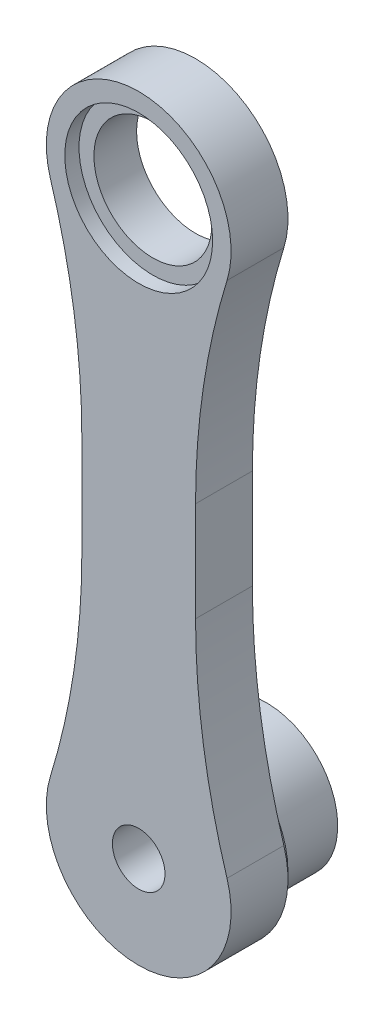
ISO-10303-21;
HEADER;
FILE_DESCRIPTION(('STEP AP214'),'2;1');
FILE_NAME('part.step','',(''),(''),'','','');
FILE_SCHEMA(('AUTOMOTIVE_DESIGN { 1 0 10303 214 1 1 1 1 }'));
ENDSEC;
DATA;
#1=APPLICATION_CONTEXT('core data for automotive mechanical design processes');
#2=APPLICATION_PROTOCOL_DEFINITION('international standard','automotive_design',2000,#1);
#3=PRODUCT_CONTEXT('',#1,'mechanical');
#4=PRODUCT('Part','Part','',(#3));
#5=PRODUCT_RELATED_PRODUCT_CATEGORY('part','',(#4));
#6=PRODUCT_DEFINITION_FORMATION('','',#4);
#7=PRODUCT_DEFINITION_CONTEXT('part definition',#1,'design');
#8=PRODUCT_DEFINITION('design','',#6,#7);
#9=PRODUCT_DEFINITION_SHAPE('','',#8);
#10=(LENGTH_UNIT() NAMED_UNIT(*) SI_UNIT(.MILLI.,.METRE.));
#11=(NAMED_UNIT(*) PLANE_ANGLE_UNIT() SI_UNIT($,.RADIAN.));
#12=(NAMED_UNIT(*) SI_UNIT($,.STERADIAN.) SOLID_ANGLE_UNIT());
#13=UNCERTAINTY_MEASURE_WITH_UNIT(LENGTH_MEASURE(1.E-05),#10,'distance_accuracy_value','');
#14=(GEOMETRIC_REPRESENTATION_CONTEXT(3) GLOBAL_UNCERTAINTY_ASSIGNED_CONTEXT((#13)) GLOBAL_UNIT_ASSIGNED_CONTEXT((#10,
#11,#12)) REPRESENTATION_CONTEXT('',''));
#15=CARTESIAN_POINT('',(0.,0.,0.));
#16=DIRECTION('',(0.,0.,1.));
#17=DIRECTION('',(1.,0.,0.));
#18=AXIS2_PLACEMENT_3D('',#15,#16,#17);
#19=CARTESIAN_POINT('',(-1.99995814207109,-6.32850083022723,4.));
#20=DIRECTION('',(0.,0.,-1.));
#21=DIRECTION('',(-1.,0.,0.));
#22=AXIS2_PLACEMENT_3D('',#19,#20,#21);
#23=CYLINDRICAL_SURFACE('',#22,4.15);
#24=CARTESIAN_POINT('',(-1.99995814207109,-6.32850083022723,0.));
#25=DIRECTION('',(0.,0.,1.));
#26=DIRECTION('',(-1.,0.,0.));
#27=AXIS2_PLACEMENT_3D('',#24,#25,#26);
#28=CIRCLE('',#27,4.15);
#29=CARTESIAN_POINT('',(-6.14995814207109,-6.32850083022723,0.));
#30=VERTEX_POINT('',#29);
#31=EDGE_CURVE('E128',#30,#30,#28,.T.);
#32=ORIENTED_EDGE('',*,*,#31,.F.);
#33=EDGE_LOOP('',(#32));
#34=FACE_BOUND('',#33,.T.);
#35=CARTESIAN_POINT('',(-1.99995814207109,-6.32850083022723,3.));
#36=DIRECTION('',(0.,0.,1.));
#37=DIRECTION('',(1.,0.,0.));
#38=AXIS2_PLACEMENT_3D('',#35,#36,#37);
#39=CIRCLE('',#38,4.15);
#40=CARTESIAN_POINT('',(2.15004185792891,-6.32850083022723,3.));
#41=VERTEX_POINT('',#40);
#42=EDGE_CURVE('E37',#41,#41,#39,.T.);
#43=ORIENTED_EDGE('',*,*,#42,.T.);
#44=EDGE_LOOP('',(#43));
#45=FACE_BOUND('',#44,.T.);
#46=ADVANCED_FACE('F33',(#34,#45),#23,.F.);
#47=CARTESIAN_POINT('',(-1.99995814207109,-46.5754515961868,4.));
#48=DIRECTION('',(0.,0.,-1.));
#49=DIRECTION('',(-1.,0.,0.));
#50=AXIS2_PLACEMENT_3D('',#47,#48,#49);
#51=PLANE('',#50);
#52=CARTESIAN_POINT('',(-1.99995814207109,-6.32850083022723,4.));
#53=DIRECTION('',(0.,0.,1.));
#54=DIRECTION('',(1.,0.,0.));
#55=AXIS2_PLACEMENT_3D('',#52,#53,#54);
#56=CIRCLE('',#55,5.2);
#57=CARTESIAN_POINT('',(3.20004185792891,-6.32850083022723,4.));
#58=VERTEX_POINT('',#57);
#59=EDGE_CURVE('E185',#58,#58,#56,.T.);
#60=ORIENTED_EDGE('',*,*,#59,.F.);
#61=EDGE_LOOP('',(#60));
#62=FACE_BOUND('',#61,.T.);
#63=CARTESIAN_POINT('',(-1.99995814207109,-46.5754515961868,4.));
#64=DIRECTION('',(0.,0.,-1.));
#65=DIRECTION('',(-1.,0.,0.));
#66=AXIS2_PLACEMENT_3D('',#63,#64,#65);
#67=CIRCLE('',#66,1.85);
#68=CARTESIAN_POINT('',(-3.84995814207109,-46.5754515961868,4.));
#69=VERTEX_POINT('',#68);
#70=EDGE_CURVE('E168',#69,#69,#67,.T.);
#71=ORIENTED_EDGE('',*,*,#70,.T.);
#72=EDGE_LOOP('',(#71));
#73=FACE_BOUND('',#72,.T.);
#74=DIRECTION('',(0.,-1.,0.));
#75=VECTOR('',#74,1.);
#76=CARTESIAN_POINT('',(-5.99995814207109,-11.451976213207,4.));
#77=LINE('',#76,#75);
#78=CARTESIAN_POINT('',(-5.99995814207109,-22.9492709688219,4.));
#79=VERTEX_POINT('',#78);
#80=CARTESIAN_POINT('',(-5.99995814207109,-29.9546814575922,4.));
#81=VERTEX_POINT('',#80);
#82=EDGE_CURVE('E137',#79,#81,#77,.T.);
#83=ORIENTED_EDGE('',*,*,#82,.T.);
#84=CARTESIAN_POINT('',(-55.9999581420711,-29.9546814575922,4.));
#85=DIRECTION('',(0.,0.,-1.));
#86=DIRECTION('',(-1.,0.,0.));
#87=AXIS2_PLACEMENT_3D('',#84,#85,#86);
#88=CIRCLE('',#87,50.);
#89=CARTESIAN_POINT('',(-8.21234752260206,-44.6633275979414,4.));
#90=VERTEX_POINT('',#89);
#91=EDGE_CURVE('E110',#81,#90,#88,.T.);
#92=ORIENTED_EDGE('',*,*,#91,.T.);
#93=CARTESIAN_POINT('',(-1.99995814207109,-46.5754515961868,4.));
#94=DIRECTION('',(0.,0.,1.));
#95=DIRECTION('',(-1.,0.,0.));
#96=AXIS2_PLACEMENT_3D('',#93,#94,#95);
#97=CIRCLE('',#96,6.5);
#98=CARTESIAN_POINT('',(4.21243123845988,-44.6633275979414,4.));
#99=VERTEX_POINT('',#98);
#100=EDGE_CURVE('E119',#90,#99,#97,.T.);
#101=ORIENTED_EDGE('',*,*,#100,.T.);
#102=CARTESIAN_POINT('',(52.0000418579289,-29.9546814575921,4.));
#103=DIRECTION('',(0.,0.,-1.));
#104=DIRECTION('',(-1.,0.,0.));
#105=AXIS2_PLACEMENT_3D('',#102,#103,#104);
#106=CIRCLE('',#105,50.);
#107=CARTESIAN_POINT('',(2.00004185792891,-29.9546814575921,4.));
#108=VERTEX_POINT('',#107);
#109=EDGE_CURVE('E158',#99,#108,#106,.T.);
#110=ORIENTED_EDGE('',*,*,#109,.T.);
#111=DIRECTION('',(0.,1.,0.));
#112=VECTOR('',#111,1.);
#113=CARTESIAN_POINT('',(2.00004185792891,-11.451976213207,4.));
#114=LINE('',#113,#112);
#115=CARTESIAN_POINT('',(2.00004185792891,-22.9492709688219,4.));
#116=VERTEX_POINT('',#115);
#117=EDGE_CURVE('E197',#108,#116,#114,.T.);
#118=ORIENTED_EDGE('',*,*,#117,.T.);
#119=CARTESIAN_POINT('',(52.0000418579289,-22.9492709688219,4.));
#120=DIRECTION('',(0.,0.,-1.));
#121=DIRECTION('',(-1.,0.,0.));
#122=AXIS2_PLACEMENT_3D('',#119,#120,#121);
#123=CIRCLE('',#122,50.);
#124=CARTESIAN_POINT('',(4.21243123845988,-8.24062482847263,4.));
#125=VERTEX_POINT('',#124);
#126=EDGE_CURVE('E11',#116,#125,#123,.T.);
#127=ORIENTED_EDGE('',*,*,#126,.T.);
#128=CARTESIAN_POINT('',(-1.99995814207109,-6.32850083022723,4.));
#129=DIRECTION('',(0.,0.,1.));
#130=DIRECTION('',(1.,0.,0.));
#131=AXIS2_PLACEMENT_3D('',#128,#129,#130);
#132=CIRCLE('',#131,6.5);
#133=CARTESIAN_POINT('',(-8.21234752260206,-8.24062482847263,4.));
#134=VERTEX_POINT('',#133);
#135=EDGE_CURVE('E198',#125,#134,#132,.T.);
#136=ORIENTED_EDGE('',*,*,#135,.T.);
#137=CARTESIAN_POINT('',(-55.9999581420711,-22.9492709688219,4.));
#138=DIRECTION('',(0.,0.,-1.));
#139=DIRECTION('',(-1.,0.,0.));
#140=AXIS2_PLACEMENT_3D('',#137,#138,#139);
#141=CIRCLE('',#140,50.);
#142=EDGE_CURVE('E162',#134,#79,#141,.T.);
#143=ORIENTED_EDGE('',*,*,#142,.T.);
#144=EDGE_LOOP('',(#83,#92,#101,#110,#118,#127,#136,#143));
#145=FACE_BOUND('',#144,.T.);
#146=ADVANCED_FACE('F202',(#62,#73,#145),#51,.F.);
#147=CARTESIAN_POINT('',(-1.99995814207109,-46.5754515961868,0.));
#148=DIRECTION('',(0.,0.,-1.));
#149=DIRECTION('',(-1.,0.,0.));
#150=AXIS2_PLACEMENT_3D('',#147,#148,#149);
#151=PLANE('',#150);
#152=CARTESIAN_POINT('',(-1.99995814207109,-46.5754515961868,0.));
#153=DIRECTION('',(0.,0.,-1.));
#154=DIRECTION('',(-1.,0.,0.));
#155=AXIS2_PLACEMENT_3D('',#152,#153,#154);
#156=CIRCLE('',#155,6.);
#157=CARTESIAN_POINT('',(-7.99995814207109,-46.5754515961868,0.));
#158=VERTEX_POINT('',#157);
#159=EDGE_CURVE('E188',#158,#158,#156,.T.);
#160=ORIENTED_EDGE('',*,*,#159,.F.);
#161=EDGE_LOOP('',(#160));
#162=FACE_BOUND('',#161,.T.);
#163=CARTESIAN_POINT('',(-1.99995814207109,-46.5754515961868,0.));
#164=DIRECTION('',(0.,0.,1.));
#165=DIRECTION('',(-1.,0.,0.));
#166=AXIS2_PLACEMENT_3D('',#163,#164,#165);
#167=CIRCLE('',#166,6.5);
#168=CARTESIAN_POINT('',(-8.21234752260206,-44.6633275979414,0.));
#169=VERTEX_POINT('',#168);
#170=CARTESIAN_POINT('',(4.21243123845988,-44.6633275979414,0.));
#171=VERTEX_POINT('',#170);
#172=EDGE_CURVE('E116',#169,#171,#167,.T.);
#173=ORIENTED_EDGE('',*,*,#172,.F.);
#174=CARTESIAN_POINT('',(-55.9999581420711,-29.9546814575922,0.));
#175=DIRECTION('',(0.,0.,-1.));
#176=DIRECTION('',(-1.,0.,0.));
#177=AXIS2_PLACEMENT_3D('',#174,#175,#176);
#178=CIRCLE('',#177,50.);
#179=CARTESIAN_POINT('',(-5.99995814207109,-29.9546814575922,0.));
#180=VERTEX_POINT('',#179);
#181=EDGE_CURVE('E100',#169,#180,#178,.F.);
#182=ORIENTED_EDGE('',*,*,#181,.T.);
#183=DIRECTION('',(0.,-1.,0.));
#184=VECTOR('',#183,1.);
#185=CARTESIAN_POINT('',(-5.99995814207109,-11.451976213207,0.));
#186=LINE('',#185,#184);
#187=CARTESIAN_POINT('',(-5.99995814207109,-22.9492709688219,0.));
#188=VERTEX_POINT('',#187);
#189=EDGE_CURVE('E141',#188,#180,#186,.T.);
#190=ORIENTED_EDGE('',*,*,#189,.F.);
#191=CARTESIAN_POINT('',(-55.9999581420711,-22.9492709688219,0.));
#192=DIRECTION('',(0.,0.,-1.));
#193=DIRECTION('',(-1.,0.,0.));
#194=AXIS2_PLACEMENT_3D('',#191,#192,#193);
#195=CIRCLE('',#194,50.);
#196=CARTESIAN_POINT('',(-8.21234752260206,-8.24062482847263,0.));
#197=VERTEX_POINT('',#196);
#198=EDGE_CURVE('E160',#188,#197,#195,.F.);
#199=ORIENTED_EDGE('',*,*,#198,.T.);
#200=CARTESIAN_POINT('',(-1.99995814207109,-6.32850083022723,0.));
#201=DIRECTION('',(0.,0.,1.));
#202=DIRECTION('',(1.,0.,0.));
#203=AXIS2_PLACEMENT_3D('',#200,#201,#202);
#204=CIRCLE('',#203,6.5);
#205=CARTESIAN_POINT('',(4.21243123845988,-8.24062482847263,0.));
#206=VERTEX_POINT('',#205);
#207=EDGE_CURVE('E131',#206,#197,#204,.T.);
#208=ORIENTED_EDGE('',*,*,#207,.F.);
#209=CARTESIAN_POINT('',(52.0000418579289,-22.9492709688219,0.));
#210=DIRECTION('',(0.,0.,-1.));
#211=DIRECTION('',(-1.,0.,0.));
#212=AXIS2_PLACEMENT_3D('',#209,#210,#211);
#213=CIRCLE('',#212,50.);
#214=CARTESIAN_POINT('',(2.00004185792891,-22.9492709688219,0.));
#215=VERTEX_POINT('',#214);
#216=EDGE_CURVE('E42',#206,#215,#213,.F.);
#217=ORIENTED_EDGE('',*,*,#216,.T.);
#218=DIRECTION('',(0.,1.,0.));
#219=VECTOR('',#218,1.);
#220=CARTESIAN_POINT('',(2.00004185792891,-11.451976213207,0.));
#221=LINE('',#220,#219);
#222=CARTESIAN_POINT('',(2.00004185792891,-29.9546814575921,0.));
#223=VERTEX_POINT('',#222);
#224=EDGE_CURVE('E127',#223,#215,#221,.T.);
#225=ORIENTED_EDGE('',*,*,#224,.F.);
#226=CARTESIAN_POINT('',(52.0000418579289,-29.9546814575921,0.));
#227=DIRECTION('',(0.,0.,-1.));
#228=DIRECTION('',(-1.,0.,0.));
#229=AXIS2_PLACEMENT_3D('',#226,#227,#228);
#230=CIRCLE('',#229,50.);
#231=EDGE_CURVE('E126',#223,#171,#230,.F.);
#232=ORIENTED_EDGE('',*,*,#231,.T.);
#233=EDGE_LOOP('',(#173,#182,#190,#199,#208,#217,#225,#232));
#234=FACE_BOUND('',#233,.T.);
#235=ORIENTED_EDGE('',*,*,#31,.T.);
#236=EDGE_LOOP('',(#235));
#237=FACE_BOUND('',#236,.T.);
#238=ADVANCED_FACE('F123',(#162,#234,#237),#151,.T.);
#239=CARTESIAN_POINT('',(-1.99995814207109,-46.5754515961868,4.));
#240=DIRECTION('',(0.,0.,-1.));
#241=DIRECTION('',(-1.,0.,0.));
#242=AXIS2_PLACEMENT_3D('',#239,#240,#241);
#243=CYLINDRICAL_SURFACE('',#242,6.5);
#244=ORIENTED_EDGE('',*,*,#100,.F.);
#245=DIRECTION('',(0.,0.,-1.));
#246=VECTOR('',#245,1.);
#247=CARTESIAN_POINT('',(-8.21234752260206,-44.6633275979414,4.));
#248=LINE('',#247,#246);
#249=EDGE_CURVE('E104',#90,#169,#248,.T.);
#250=ORIENTED_EDGE('',*,*,#249,.T.);
#251=ORIENTED_EDGE('',*,*,#172,.T.);
#252=DIRECTION('',(0.,0.,-1.));
#253=VECTOR('',#252,1.);
#254=CARTESIAN_POINT('',(4.21243123845988,-44.6633275979414,4.));
#255=LINE('',#254,#253);
#256=EDGE_CURVE('E121',#171,#99,#255,.F.);
#257=ORIENTED_EDGE('',*,*,#256,.T.);
#258=EDGE_LOOP('',(#244,#250,#251,#257));
#259=FACE_BOUND('',#258,.T.);
#260=ADVANCED_FACE('F115',(#259),#243,.T.);
#261=CARTESIAN_POINT('',(2.00004185792891,-11.451976213207,4.));
#262=DIRECTION('',(-1.,0.,0.));
#263=DIRECTION('',(0.,-1.,0.));
#264=AXIS2_PLACEMENT_3D('',#261,#262,#263);
#265=PLANE('',#264);
#266=ORIENTED_EDGE('',*,*,#117,.F.);
#267=DIRECTION('',(0.,0.,1.));
#268=VECTOR('',#267,1.);
#269=CARTESIAN_POINT('',(2.00004185792891,-29.9546814575921,0.));
#270=LINE('',#269,#268);
#271=EDGE_CURVE('E149',#108,#223,#270,.F.);
#272=ORIENTED_EDGE('',*,*,#271,.T.);
#273=ORIENTED_EDGE('',*,*,#224,.T.);
#274=DIRECTION('',(0.,0.,1.));
#275=VECTOR('',#274,1.);
#276=CARTESIAN_POINT('',(2.00004185792891,-22.9492709688219,4.));
#277=LINE('',#276,#275);
#278=EDGE_CURVE('E147',#215,#116,#277,.T.);
#279=ORIENTED_EDGE('',*,*,#278,.T.);
#280=EDGE_LOOP('',(#266,#272,#273,#279));
#281=FACE_BOUND('',#280,.T.);
#282=ADVANCED_FACE('F215',(#281),#265,.F.);
#283=CARTESIAN_POINT('',(-1.99995814207109,-6.32850083022723,4.));
#284=DIRECTION('',(0.,0.,-1.));
#285=DIRECTION('',(-1.,0.,0.));
#286=AXIS2_PLACEMENT_3D('',#283,#284,#285);
#287=CYLINDRICAL_SURFACE('',#286,6.5);
#288=ORIENTED_EDGE('',*,*,#207,.T.);
#289=DIRECTION('',(0.,0.,-1.));
#290=VECTOR('',#289,1.);
#291=CARTESIAN_POINT('',(-8.21234752260206,-8.24062482847263,4.));
#292=LINE('',#291,#290);
#293=EDGE_CURVE('E50',#197,#134,#292,.F.);
#294=ORIENTED_EDGE('',*,*,#293,.T.);
#295=ORIENTED_EDGE('',*,*,#135,.F.);
#296=DIRECTION('',(0.,0.,-1.));
#297=VECTOR('',#296,1.);
#298=CARTESIAN_POINT('',(4.21243123845988,-8.24062482847263,4.));
#299=LINE('',#298,#297);
#300=EDGE_CURVE('E152',#125,#206,#299,.T.);
#301=ORIENTED_EDGE('',*,*,#300,.T.);
#302=EDGE_LOOP('',(#288,#294,#295,#301));
#303=FACE_BOUND('',#302,.T.);
#304=ADVANCED_FACE('F209',(#303),#287,.T.);
#305=CARTESIAN_POINT('',(-5.99995814207109,-11.451976213207,4.));
#306=DIRECTION('',(1.,0.,0.));
#307=DIRECTION('',(0.,0.,-1.));
#308=AXIS2_PLACEMENT_3D('',#305,#306,#307);
#309=PLANE('',#308);
#310=ORIENTED_EDGE('',*,*,#189,.T.);
#311=DIRECTION('',(0.,0.,1.));
#312=VECTOR('',#311,1.);
#313=CARTESIAN_POINT('',(-5.99995814207109,-29.9546814575922,4.));
#314=LINE('',#313,#312);
#315=EDGE_CURVE('E105',#180,#81,#314,.T.);
#316=ORIENTED_EDGE('',*,*,#315,.T.);
#317=ORIENTED_EDGE('',*,*,#82,.F.);
#318=DIRECTION('',(0.,0.,1.));
#319=VECTOR('',#318,1.);
#320=CARTESIAN_POINT('',(-5.99995814207109,-22.9492709688219,0.));
#321=LINE('',#320,#319);
#322=EDGE_CURVE('E120',#79,#188,#321,.F.);
#323=ORIENTED_EDGE('',*,*,#322,.T.);
#324=EDGE_LOOP('',(#310,#316,#317,#323));
#325=FACE_BOUND('',#324,.T.);
#326=ADVANCED_FACE('F205',(#325),#309,.F.);
#327=CARTESIAN_POINT('',(-55.9999581420711,-29.9546814575922,4.));
#328=DIRECTION('',(0.,0.,-1.));
#329=DIRECTION('',(-1.,0.,0.));
#330=AXIS2_PLACEMENT_3D('',#327,#328,#329);
#331=CYLINDRICAL_SURFACE('',#330,50.);
#332=ORIENTED_EDGE('',*,*,#91,.F.);
#333=ORIENTED_EDGE('',*,*,#315,.F.);
#334=ORIENTED_EDGE('',*,*,#181,.F.);
#335=ORIENTED_EDGE('',*,*,#249,.F.);
#336=EDGE_LOOP('',(#332,#333,#334,#335));
#337=FACE_BOUND('',#336,.T.);
#338=ADVANCED_FACE('F103',(#337),#331,.F.);
#339=CARTESIAN_POINT('',(52.0000418579289,-29.9546814575921,4.));
#340=DIRECTION('',(0.,0.,-1.));
#341=DIRECTION('',(-1.,0.,0.));
#342=AXIS2_PLACEMENT_3D('',#339,#340,#341);
#343=CYLINDRICAL_SURFACE('',#342,50.);
#344=ORIENTED_EDGE('',*,*,#109,.F.);
#345=ORIENTED_EDGE('',*,*,#256,.F.);
#346=ORIENTED_EDGE('',*,*,#231,.F.);
#347=ORIENTED_EDGE('',*,*,#271,.F.);
#348=EDGE_LOOP('',(#344,#345,#346,#347));
#349=FACE_BOUND('',#348,.T.);
#350=ADVANCED_FACE('F219',(#349),#343,.F.);
#351=CARTESIAN_POINT('',(-55.9999581420711,-22.9492709688219,4.));
#352=DIRECTION('',(0.,0.,-1.));
#353=DIRECTION('',(-1.,0.,0.));
#354=AXIS2_PLACEMENT_3D('',#351,#352,#353);
#355=CYLINDRICAL_SURFACE('',#354,50.);
#356=ORIENTED_EDGE('',*,*,#142,.F.);
#357=ORIENTED_EDGE('',*,*,#293,.F.);
#358=ORIENTED_EDGE('',*,*,#198,.F.);
#359=ORIENTED_EDGE('',*,*,#322,.F.);
#360=EDGE_LOOP('',(#356,#357,#358,#359));
#361=FACE_BOUND('',#360,.T.);
#362=ADVANCED_FACE('F207',(#361),#355,.F.);
#363=CARTESIAN_POINT('',(52.0000418579289,-22.9492709688219,4.));
#364=DIRECTION('',(0.,0.,-1.));
#365=DIRECTION('',(-1.,0.,0.));
#366=AXIS2_PLACEMENT_3D('',#363,#364,#365);
#367=CYLINDRICAL_SURFACE('',#366,50.);
#368=ORIENTED_EDGE('',*,*,#126,.F.);
#369=ORIENTED_EDGE('',*,*,#278,.F.);
#370=ORIENTED_EDGE('',*,*,#216,.F.);
#371=ORIENTED_EDGE('',*,*,#300,.F.);
#372=EDGE_LOOP('',(#368,#369,#370,#371));
#373=FACE_BOUND('',#372,.T.);
#374=ADVANCED_FACE('F35',(#373),#367,.F.);
#375=CARTESIAN_POINT('',(-1.99995814207109,-46.5754515961868,-0.5));
#376=DIRECTION('',(0.,0.,1.));
#377=DIRECTION('',(1.,0.,0.));
#378=AXIS2_PLACEMENT_3D('',#375,#376,#377);
#379=CYLINDRICAL_SURFACE('',#378,6.);
#380=CARTESIAN_POINT('',(-1.99995814207109,-46.5754515961868,-0.5));
#381=DIRECTION('',(0.,0.,-1.));
#382=DIRECTION('',(-1.,0.,0.));
#383=AXIS2_PLACEMENT_3D('',#380,#381,#382);
#384=CIRCLE('',#383,6.);
#385=CARTESIAN_POINT('',(-7.99995814207109,-46.5754515961868,-0.5));
#386=VERTEX_POINT('',#385);
#387=EDGE_CURVE('E167',#386,#386,#384,.T.);
#388=ORIENTED_EDGE('',*,*,#387,.F.);
#389=EDGE_LOOP('',(#388));
#390=FACE_BOUND('',#389,.T.);
#391=ORIENTED_EDGE('',*,*,#159,.T.);
#392=EDGE_LOOP('',(#391));
#393=FACE_BOUND('',#392,.T.);
#394=ADVANCED_FACE('F289',(#390,#393),#379,.T.);
#395=CARTESIAN_POINT('',(-1.99995814207109,-46.5754515961868,-0.5));
#396=DIRECTION('',(0.,0.,-1.));
#397=DIRECTION('',(-1.,0.,0.));
#398=AXIS2_PLACEMENT_3D('',#395,#396,#397);
#399=PLANE('',#398);
#400=CARTESIAN_POINT('',(-1.99995814207109,-46.5754515961868,-0.5));
#401=DIRECTION('',(0.,0.,-1.));
#402=DIRECTION('',(-1.,0.,0.));
#403=AXIS2_PLACEMENT_3D('',#400,#401,#402);
#404=CIRCLE('',#403,5.);
#405=CARTESIAN_POINT('',(-6.99995814207109,-46.5754515961868,-0.5));
#406=VERTEX_POINT('',#405);
#407=EDGE_CURVE('E165',#406,#406,#404,.T.);
#408=ORIENTED_EDGE('',*,*,#407,.F.);
#409=EDGE_LOOP('',(#408));
#410=FACE_BOUND('',#409,.T.);
#411=ORIENTED_EDGE('',*,*,#387,.T.);
#412=EDGE_LOOP('',(#411));
#413=FACE_BOUND('',#412,.T.);
#414=ADVANCED_FACE('F304',(#410,#413),#399,.T.);
#415=CARTESIAN_POINT('',(-1.99995814207109,-46.5754515961868,-5.));
#416=DIRECTION('',(0.,0.,-1.));
#417=DIRECTION('',(-1.,0.,0.));
#418=AXIS2_PLACEMENT_3D('',#415,#416,#417);
#419=PLANE('',#418);
#420=CARTESIAN_POINT('',(-1.99995814207109,-46.5754515961868,-5.));
#421=DIRECTION('',(0.,0.,-1.));
#422=DIRECTION('',(-1.,0.,0.));
#423=AXIS2_PLACEMENT_3D('',#420,#421,#422);
#424=CIRCLE('',#423,3.15);
#425=CARTESIAN_POINT('',(-5.14995814207109,-46.5754515961868,-5.));
#426=VERTEX_POINT('',#425);
#427=EDGE_CURVE('E170',#426,#426,#424,.T.);
#428=ORIENTED_EDGE('',*,*,#427,.F.);
#429=EDGE_LOOP('',(#428));
#430=FACE_BOUND('',#429,.T.);
#431=CARTESIAN_POINT('',(-1.99995814207109,-46.5754515961868,-5.));
#432=DIRECTION('',(0.,0.,-1.));
#433=DIRECTION('',(-1.,0.,0.));
#434=AXIS2_PLACEMENT_3D('',#431,#432,#433);
#435=CIRCLE('',#434,5.);
#436=CARTESIAN_POINT('',(-6.99995814207109,-46.5754515961868,-5.));
#437=VERTEX_POINT('',#436);
#438=EDGE_CURVE('E134',#437,#437,#435,.T.);
#439=ORIENTED_EDGE('',*,*,#438,.T.);
#440=EDGE_LOOP('',(#439));
#441=FACE_BOUND('',#440,.T.);
#442=ADVANCED_FACE('F315',(#430,#441),#419,.T.);
#443=CARTESIAN_POINT('',(-1.99995814207109,-46.5754515961868,-5.));
#444=DIRECTION('',(0.,0.,1.));
#445=DIRECTION('',(1.,0.,0.));
#446=AXIS2_PLACEMENT_3D('',#443,#444,#445);
#447=CYLINDRICAL_SURFACE('',#446,5.);
#448=ORIENTED_EDGE('',*,*,#407,.T.);
#449=EDGE_LOOP('',(#448));
#450=FACE_BOUND('',#449,.T.);
#451=ORIENTED_EDGE('',*,*,#438,.F.);
#452=EDGE_LOOP('',(#451));
#453=FACE_BOUND('',#452,.T.);
#454=ADVANCED_FACE('F238',(#450,#453),#447,.T.);
#455=CARTESIAN_POINT('',(-1.99995814207109,-46.5754515961868,-2.));
#456=DIRECTION('',(0.,0.,-1.));
#457=DIRECTION('',(-1.,0.,0.));
#458=AXIS2_PLACEMENT_3D('',#455,#456,#457);
#459=CYLINDRICAL_SURFACE('',#458,3.15);
#460=CARTESIAN_POINT('',(-1.99995814207109,-46.5754515961868,-2.));
#461=DIRECTION('',(0.,0.,-1.));
#462=DIRECTION('',(-1.,0.,0.));
#463=AXIS2_PLACEMENT_3D('',#460,#461,#462);
#464=CIRCLE('',#463,3.15);
#465=CARTESIAN_POINT('',(-5.14995814207109,-46.5754515961868,-2.));
#466=VERTEX_POINT('',#465);
#467=EDGE_CURVE('E175',#466,#466,#464,.T.);
#468=ORIENTED_EDGE('',*,*,#467,.F.);
#469=EDGE_LOOP('',(#468));
#470=FACE_BOUND('',#469,.T.);
#471=ORIENTED_EDGE('',*,*,#427,.T.);
#472=EDGE_LOOP('',(#471));
#473=FACE_BOUND('',#472,.T.);
#474=ADVANCED_FACE('F326',(#470,#473),#459,.F.);
#475=CARTESIAN_POINT('',(-1.99995814207109,-46.5754515961868,-2.));
#476=DIRECTION('',(0.,0.,-1.));
#477=DIRECTION('',(-1.,0.,0.));
#478=AXIS2_PLACEMENT_3D('',#475,#476,#477);
#479=PLANE('',#478);
#480=CARTESIAN_POINT('',(-1.99995814207109,-46.5754515961868,-2.));
#481=DIRECTION('',(0.,0.,-1.));
#482=DIRECTION('',(-1.,0.,0.));
#483=AXIS2_PLACEMENT_3D('',#480,#481,#482);
#484=CIRCLE('',#483,1.85);
#485=CARTESIAN_POINT('',(-3.84995814207109,-46.5754515961868,-2.));
#486=VERTEX_POINT('',#485);
#487=EDGE_CURVE('E171',#486,#486,#484,.T.);
#488=ORIENTED_EDGE('',*,*,#487,.F.);
#489=EDGE_LOOP('',(#488));
#490=FACE_BOUND('',#489,.T.);
#491=ORIENTED_EDGE('',*,*,#467,.T.);
#492=EDGE_LOOP('',(#491));
#493=FACE_BOUND('',#492,.T.);
#494=ADVANCED_FACE('F340',(#490,#493),#479,.T.);
#495=CARTESIAN_POINT('',(-1.99995814207109,-46.5754515961868,8.));
#496=DIRECTION('',(0.,0.,-1.));
#497=DIRECTION('',(-1.,0.,0.));
#498=AXIS2_PLACEMENT_3D('',#495,#496,#497);
#499=CYLINDRICAL_SURFACE('',#498,1.85);
#500=ORIENTED_EDGE('',*,*,#487,.T.);
#501=EDGE_LOOP('',(#500));
#502=FACE_BOUND('',#501,.T.);
#503=ORIENTED_EDGE('',*,*,#70,.F.);
#504=EDGE_LOOP('',(#503));
#505=FACE_BOUND('',#504,.T.);
#506=ADVANCED_FACE('F350',(#502,#505),#499,.F.);
#507=CARTESIAN_POINT('',(-1.99995814207109,-6.32850083022723,3.));
#508=DIRECTION('',(0.,0.,1.));
#509=DIRECTION('',(1.,0.,0.));
#510=AXIS2_PLACEMENT_3D('',#507,#508,#509);
#511=CYLINDRICAL_SURFACE('',#510,5.2);
#512=CARTESIAN_POINT('',(-1.99995814207109,-6.32850083022723,3.));
#513=DIRECTION('',(0.,0.,1.));
#514=DIRECTION('',(1.,0.,0.));
#515=AXIS2_PLACEMENT_3D('',#512,#513,#514);
#516=CIRCLE('',#515,5.2);
#517=CARTESIAN_POINT('',(3.20004185792891,-6.32850083022723,3.));
#518=VERTEX_POINT('',#517);
#519=EDGE_CURVE('E182',#518,#518,#516,.T.);
#520=ORIENTED_EDGE('',*,*,#519,.F.);
#521=EDGE_LOOP('',(#520));
#522=FACE_BOUND('',#521,.T.);
#523=ORIENTED_EDGE('',*,*,#59,.T.);
#524=EDGE_LOOP('',(#523));
#525=FACE_BOUND('',#524,.T.);
#526=ADVANCED_FACE('F359',(#522,#525),#511,.F.);
#527=CARTESIAN_POINT('',(-1.99995814207109,-6.32850083022723,3.));
#528=DIRECTION('',(0.,0.,1.));
#529=DIRECTION('',(1.,0.,0.));
#530=AXIS2_PLACEMENT_3D('',#527,#528,#529);
#531=PLANE('',#530);
#532=ORIENTED_EDGE('',*,*,#42,.F.);
#533=EDGE_LOOP('',(#532));
#534=FACE_BOUND('',#533,.T.);
#535=ORIENTED_EDGE('',*,*,#519,.T.);
#536=EDGE_LOOP('',(#535));
#537=FACE_BOUND('',#536,.T.);
#538=ADVANCED_FACE('F378',(#534,#537),#531,.T.);
#539=CLOSED_SHELL('',(#46,#146,#238,#260,#282,#304,#326,#338,#350,#362,#374,#394,#414,#442,#454,
#474,#494,#506,#526,#538));
#540=MANIFOLD_SOLID_BREP('B2',#539);
#541=ADVANCED_BREP_SHAPE_REPRESENTATION('',(#18,#540),#14);
#542=SHAPE_DEFINITION_REPRESENTATION(#9,#541);
ENDSEC;
END-ISO-10303-21;
